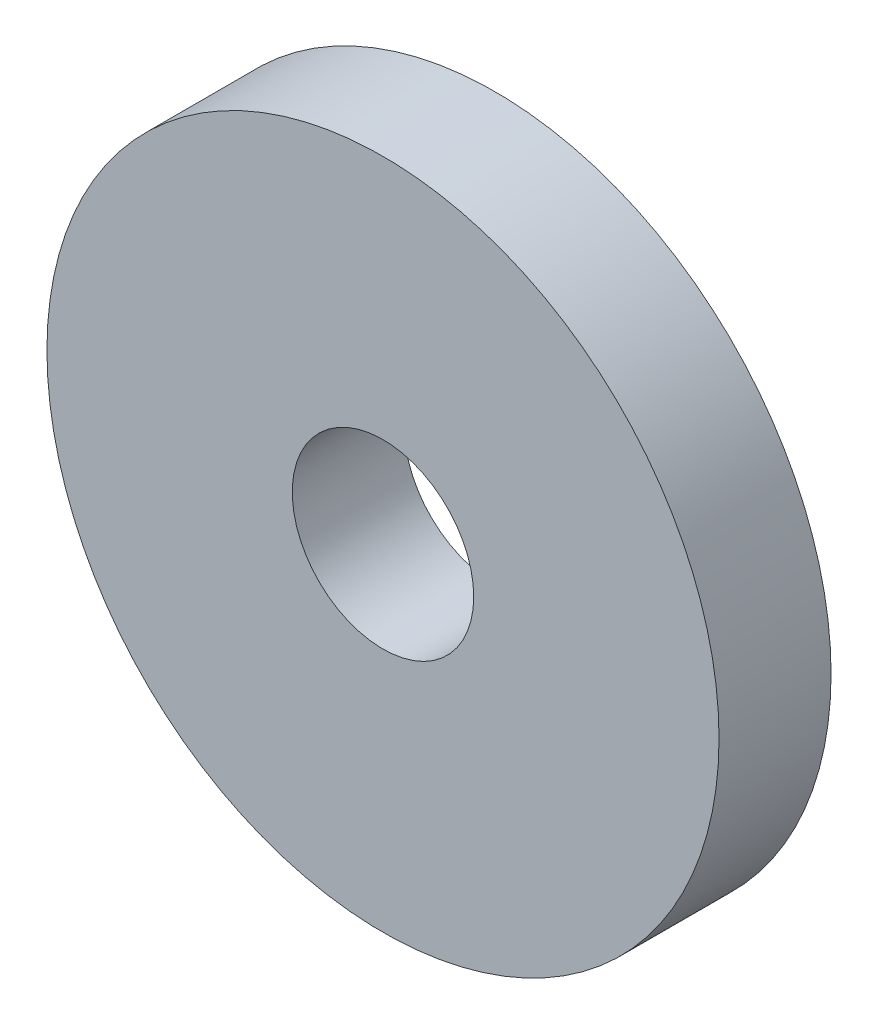
ISO-10303-21;
HEADER;
FILE_DESCRIPTION(('STEP AP214'),'2;1');
FILE_NAME('part.step','',(''),(''),'','','');
FILE_SCHEMA(('AUTOMOTIVE_DESIGN { 1 0 10303 214 1 1 1 1 }'));
ENDSEC;
DATA;
#1=APPLICATION_CONTEXT('core data for automotive mechanical design processes');
#2=APPLICATION_PROTOCOL_DEFINITION('international standard','automotive_design',2000,#1);
#3=PRODUCT_CONTEXT('',#1,'mechanical');
#4=PRODUCT('Part','Part','',(#3));
#5=PRODUCT_RELATED_PRODUCT_CATEGORY('part','',(#4));
#6=PRODUCT_DEFINITION_FORMATION('','',#4);
#7=PRODUCT_DEFINITION_CONTEXT('part definition',#1,'design');
#8=PRODUCT_DEFINITION('design','',#6,#7);
#9=PRODUCT_DEFINITION_SHAPE('','',#8);
#10=(LENGTH_UNIT() NAMED_UNIT(*) SI_UNIT(.MILLI.,.METRE.));
#11=(NAMED_UNIT(*) PLANE_ANGLE_UNIT() SI_UNIT($,.RADIAN.));
#12=(NAMED_UNIT(*) SI_UNIT($,.STERADIAN.) SOLID_ANGLE_UNIT());
#13=UNCERTAINTY_MEASURE_WITH_UNIT(LENGTH_MEASURE(1.E-05),#10,'distance_accuracy_value','');
#14=(GEOMETRIC_REPRESENTATION_CONTEXT(3) GLOBAL_UNCERTAINTY_ASSIGNED_CONTEXT((#13)) GLOBAL_UNIT_ASSIGNED_CONTEXT((#10,
#11,#12)) REPRESENTATION_CONTEXT('',''));
#15=CARTESIAN_POINT('',(0.,0.,0.));
#16=DIRECTION('',(0.,0.,1.));
#17=DIRECTION('',(1.,0.,0.));
#18=AXIS2_PLACEMENT_3D('',#15,#16,#17);
#19=CARTESIAN_POINT('',(0.,0.,5.));
#20=DIRECTION('',(0.,0.,1.));
#21=DIRECTION('',(1.,0.,0.));
#22=AXIS2_PLACEMENT_3D('',#19,#20,#21);
#23=PLANE('',#22);
#24=CARTESIAN_POINT('',(0.,0.,5.));
#25=DIRECTION('',(0.,0.,1.));
#26=DIRECTION('',(1.,0.,0.));
#27=AXIS2_PLACEMENT_3D('',#24,#25,#26);
#28=CIRCLE('',#27,15.);
#29=CARTESIAN_POINT('',(15.,0.,5.));
#30=VERTEX_POINT('',#29);
#31=EDGE_CURVE('E10',#30,#30,#28,.T.);
#32=ORIENTED_EDGE('',*,*,#31,.T.);
#33=EDGE_LOOP('',(#32));
#34=FACE_BOUND('',#33,.T.);
#35=CARTESIAN_POINT('',(0.,0.,5.));
#36=DIRECTION('',(0.,0.,1.));
#37=DIRECTION('',(1.,0.,0.));
#38=AXIS2_PLACEMENT_3D('',#35,#36,#37);
#39=CIRCLE('',#38,4.05);
#40=CARTESIAN_POINT('',(4.05,0.,5.));
#41=VERTEX_POINT('',#40);
#42=EDGE_CURVE('E46',#41,#41,#39,.T.);
#43=ORIENTED_EDGE('',*,*,#42,.F.);
#44=EDGE_LOOP('',(#43));
#45=FACE_BOUND('',#44,.T.);
#46=ADVANCED_FACE('F35',(#34,#45),#23,.T.);
#47=CARTESIAN_POINT('',(0.,0.,0.));
#48=DIRECTION('',(0.,0.,1.));
#49=DIRECTION('',(1.,0.,0.));
#50=AXIS2_PLACEMENT_3D('',#47,#48,#49);
#51=PLANE('',#50);
#52=CARTESIAN_POINT('',(0.,0.,0.));
#53=DIRECTION('',(0.,0.,1.));
#54=DIRECTION('',(1.,0.,0.));
#55=AXIS2_PLACEMENT_3D('',#52,#53,#54);
#56=CIRCLE('',#55,15.);
#57=CARTESIAN_POINT('',(15.,0.,0.));
#58=VERTEX_POINT('',#57);
#59=EDGE_CURVE('E39',#58,#58,#56,.T.);
#60=ORIENTED_EDGE('',*,*,#59,.F.);
#61=EDGE_LOOP('',(#60));
#62=FACE_BOUND('',#61,.T.);
#63=CARTESIAN_POINT('',(0.,0.,0.));
#64=DIRECTION('',(0.,0.,1.));
#65=DIRECTION('',(1.,0.,0.));
#66=AXIS2_PLACEMENT_3D('',#63,#64,#65);
#67=CIRCLE('',#66,4.05);
#68=CARTESIAN_POINT('',(4.05,0.,0.));
#69=VERTEX_POINT('',#68);
#70=EDGE_CURVE('E48',#69,#69,#67,.T.);
#71=ORIENTED_EDGE('',*,*,#70,.T.);
#72=EDGE_LOOP('',(#71));
#73=FACE_BOUND('',#72,.T.);
#74=ADVANCED_FACE('F58',(#62,#73),#51,.F.);
#75=CARTESIAN_POINT('',(0.,0.,5.));
#76=DIRECTION('',(0.,0.,-1.));
#77=DIRECTION('',(-1.,0.,0.));
#78=AXIS2_PLACEMENT_3D('',#75,#76,#77);
#79=CYLINDRICAL_SURFACE('',#78,15.);
#80=ORIENTED_EDGE('',*,*,#31,.F.);
#81=EDGE_LOOP('',(#80));
#82=FACE_BOUND('',#81,.T.);
#83=ORIENTED_EDGE('',*,*,#59,.T.);
#84=EDGE_LOOP('',(#83));
#85=FACE_BOUND('',#84,.T.);
#86=ADVANCED_FACE('F37',(#82,#85),#79,.T.);
#87=CARTESIAN_POINT('',(0.,0.,5.));
#88=DIRECTION('',(0.,0.,-1.));
#89=DIRECTION('',(-1.,0.,0.));
#90=AXIS2_PLACEMENT_3D('',#87,#88,#89);
#91=CYLINDRICAL_SURFACE('',#90,4.05);
#92=ORIENTED_EDGE('',*,*,#42,.T.);
#93=EDGE_LOOP('',(#92));
#94=FACE_BOUND('',#93,.T.);
#95=ORIENTED_EDGE('',*,*,#70,.F.);
#96=EDGE_LOOP('',(#95));
#97=FACE_BOUND('',#96,.T.);
#98=ADVANCED_FACE('F54',(#94,#97),#91,.F.);
#99=CLOSED_SHELL('',(#46,#74,#86,#98));
#100=MANIFOLD_SOLID_BREP('B2',#99);
#101=ADVANCED_BREP_SHAPE_REPRESENTATION('',(#18,#100),#14);
#102=SHAPE_DEFINITION_REPRESENTATION(#9,#101);
ENDSEC;
END-ISO-10303-21;
